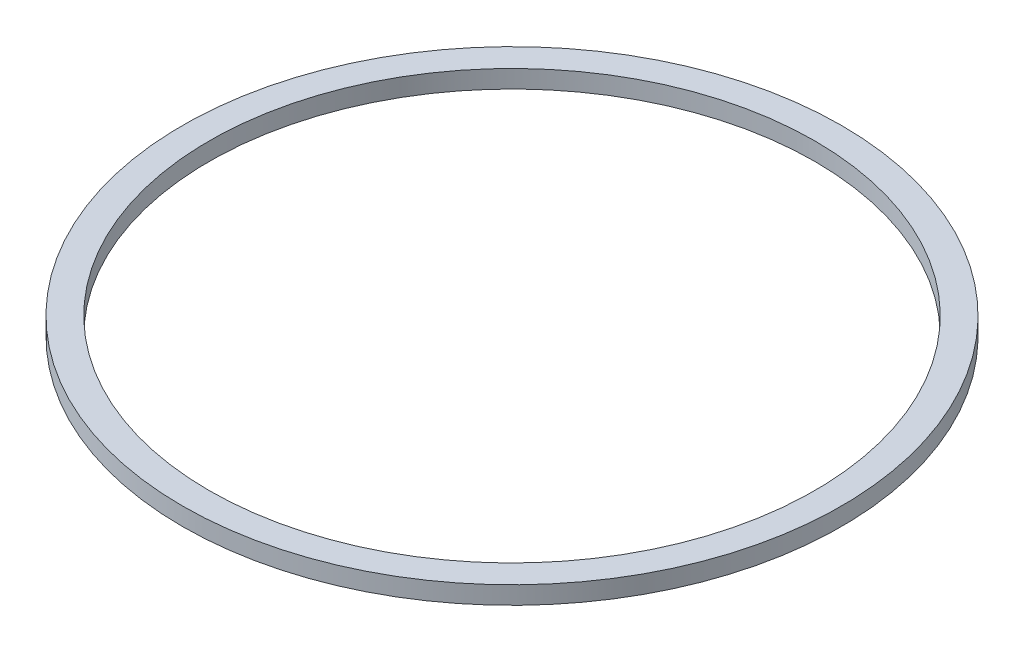
ISO-10303-21;
HEADER;
FILE_DESCRIPTION(('STEP AP214'),'2;1');
FILE_NAME('part.step','',(''),(''),'','','');
FILE_SCHEMA(('AUTOMOTIVE_DESIGN { 1 0 10303 214 1 1 1 1 }'));
ENDSEC;
DATA;
#1=APPLICATION_CONTEXT('core data for automotive mechanical design processes');
#2=APPLICATION_PROTOCOL_DEFINITION('international standard','automotive_design',2000,#1);
#3=PRODUCT_CONTEXT('',#1,'mechanical');
#4=PRODUCT('Part','Part','',(#3));
#5=PRODUCT_RELATED_PRODUCT_CATEGORY('part','',(#4));
#6=PRODUCT_DEFINITION_FORMATION('','',#4);
#7=PRODUCT_DEFINITION_CONTEXT('part definition',#1,'design');
#8=PRODUCT_DEFINITION('design','',#6,#7);
#9=PRODUCT_DEFINITION_SHAPE('','',#8);
#10=(LENGTH_UNIT() NAMED_UNIT(*) SI_UNIT(.MILLI.,.METRE.));
#11=(NAMED_UNIT(*) PLANE_ANGLE_UNIT() SI_UNIT($,.RADIAN.));
#12=(NAMED_UNIT(*) SI_UNIT($,.STERADIAN.) SOLID_ANGLE_UNIT());
#13=UNCERTAINTY_MEASURE_WITH_UNIT(LENGTH_MEASURE(1.E-05),#10,'distance_accuracy_value','');
#14=(GEOMETRIC_REPRESENTATION_CONTEXT(3) GLOBAL_UNCERTAINTY_ASSIGNED_CONTEXT((#13)) GLOBAL_UNIT_ASSIGNED_CONTEXT((#10,
#11,#12)) REPRESENTATION_CONTEXT('',''));
#15=CARTESIAN_POINT('',(0.,0.,0.));
#16=DIRECTION('',(0.,0.,1.));
#17=DIRECTION('',(1.,0.,0.));
#18=AXIS2_PLACEMENT_3D('',#15,#16,#17);
#19=CARTESIAN_POINT('',(0.,10.,0.));
#20=DIRECTION('',(0.,1.,0.));
#21=DIRECTION('',(0.,0.,1.));
#22=AXIS2_PLACEMENT_3D('',#19,#20,#21);
#23=PLANE('',#22);
#24=CARTESIAN_POINT('',(0.,10.,0.));
#25=DIRECTION('',(0.,1.,0.));
#26=DIRECTION('',(0.,0.,1.));
#27=AXIS2_PLACEMENT_3D('',#24,#25,#26);
#28=CIRCLE('',#27,185.);
#29=CARTESIAN_POINT('',(0.,10.,185.));
#30=VERTEX_POINT('',#29);
#31=EDGE_CURVE('E10',#30,#30,#28,.T.);
#32=ORIENTED_EDGE('',*,*,#31,.T.);
#33=EDGE_LOOP('',(#32));
#34=FACE_BOUND('',#33,.T.);
#35=CARTESIAN_POINT('',(0.,10.,0.));
#36=DIRECTION('',(0.,1.,0.));
#37=DIRECTION('',(0.,0.,1.));
#38=AXIS2_PLACEMENT_3D('',#35,#36,#37);
#39=CIRCLE('',#38,170.);
#40=CARTESIAN_POINT('',(0.,10.,170.));
#41=VERTEX_POINT('',#40);
#42=EDGE_CURVE('E50',#41,#41,#39,.T.);
#43=ORIENTED_EDGE('',*,*,#42,.F.);
#44=EDGE_LOOP('',(#43));
#45=FACE_BOUND('',#44,.T.);
#46=ADVANCED_FACE('F37',(#34,#45),#23,.T.);
#47=CARTESIAN_POINT('',(0.,0.,0.));
#48=DIRECTION('',(0.,1.,0.));
#49=DIRECTION('',(0.,0.,1.));
#50=AXIS2_PLACEMENT_3D('',#47,#48,#49);
#51=PLANE('',#50);
#52=CARTESIAN_POINT('',(0.,0.,0.));
#53=DIRECTION('',(0.,1.,0.));
#54=DIRECTION('',(0.,0.,1.));
#55=AXIS2_PLACEMENT_3D('',#52,#53,#54);
#56=CIRCLE('',#55,185.);
#57=CARTESIAN_POINT('',(0.,0.,185.));
#58=VERTEX_POINT('',#57);
#59=EDGE_CURVE('E41',#58,#58,#56,.T.);
#60=ORIENTED_EDGE('',*,*,#59,.F.);
#61=EDGE_LOOP('',(#60));
#62=FACE_BOUND('',#61,.T.);
#63=CARTESIAN_POINT('',(0.,0.,0.));
#64=DIRECTION('',(0.,1.,0.));
#65=DIRECTION('',(0.,0.,1.));
#66=AXIS2_PLACEMENT_3D('',#63,#64,#65);
#67=CIRCLE('',#66,170.);
#68=CARTESIAN_POINT('',(0.,0.,170.));
#69=VERTEX_POINT('',#68);
#70=EDGE_CURVE('E52',#69,#69,#67,.T.);
#71=ORIENTED_EDGE('',*,*,#70,.T.);
#72=EDGE_LOOP('',(#71));
#73=FACE_BOUND('',#72,.T.);
#74=ADVANCED_FACE('F64',(#62,#73),#51,.F.);
#75=CARTESIAN_POINT('',(0.,10.,0.));
#76=DIRECTION('',(0.,-1.,0.));
#77=DIRECTION('',(0.,0.,-1.));
#78=AXIS2_PLACEMENT_3D('',#75,#76,#77);
#79=CYLINDRICAL_SURFACE('',#78,185.);
#80=ORIENTED_EDGE('',*,*,#31,.F.);
#81=EDGE_LOOP('',(#80));
#82=FACE_BOUND('',#81,.T.);
#83=ORIENTED_EDGE('',*,*,#59,.T.);
#84=EDGE_LOOP('',(#83));
#85=FACE_BOUND('',#84,.T.);
#86=ADVANCED_FACE('F39',(#82,#85),#79,.T.);
#87=CARTESIAN_POINT('',(0.,10.,0.));
#88=DIRECTION('',(0.,-1.,0.));
#89=DIRECTION('',(0.,0.,-1.));
#90=AXIS2_PLACEMENT_3D('',#87,#88,#89);
#91=CYLINDRICAL_SURFACE('',#90,170.);
#92=ORIENTED_EDGE('',*,*,#42,.T.);
#93=EDGE_LOOP('',(#92));
#94=FACE_BOUND('',#93,.T.);
#95=ORIENTED_EDGE('',*,*,#70,.F.);
#96=EDGE_LOOP('',(#95));
#97=FACE_BOUND('',#96,.T.);
#98=ADVANCED_FACE('F60',(#94,#97),#91,.F.);
#99=CLOSED_SHELL('',(#46,#74,#86,#98));
#100=MANIFOLD_SOLID_BREP('B2',#99);
#101=ADVANCED_BREP_SHAPE_REPRESENTATION('',(#18,#100),#14);
#102=SHAPE_DEFINITION_REPRESENTATION(#9,#101);
ENDSEC;
END-ISO-10303-21;
